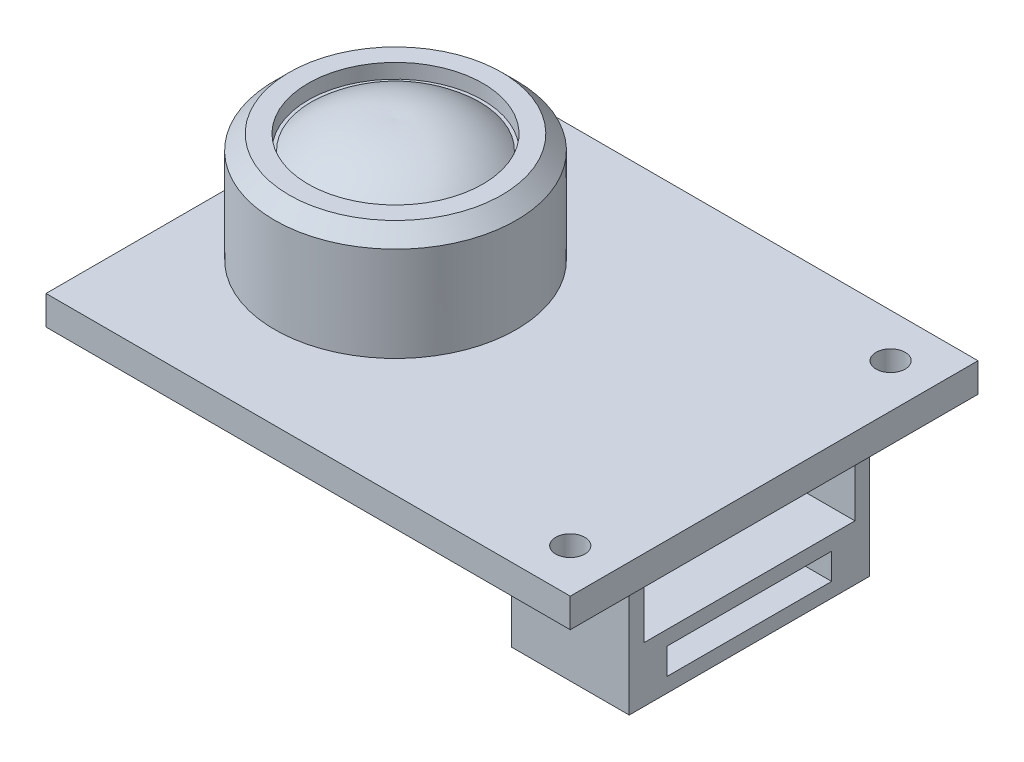
ISO-10303-21;
HEADER;
FILE_DESCRIPTION(('STEP AP214'),'2;1');
FILE_NAME('part.step','',(''),(''),'','','');
FILE_SCHEMA(('AUTOMOTIVE_DESIGN { 1 0 10303 214 1 1 1 1 }'));
ENDSEC;
DATA;
#1=APPLICATION_CONTEXT('core data for automotive mechanical design processes');
#2=APPLICATION_PROTOCOL_DEFINITION('international standard','automotive_design',2000,#1);
#3=PRODUCT_CONTEXT('',#1,'mechanical');
#4=PRODUCT('Part','Part','',(#3));
#5=PRODUCT_RELATED_PRODUCT_CATEGORY('part','',(#4));
#6=PRODUCT_DEFINITION_FORMATION('','',#4);
#7=PRODUCT_DEFINITION_CONTEXT('part definition',#1,'design');
#8=PRODUCT_DEFINITION('design','',#6,#7);
#9=PRODUCT_DEFINITION_SHAPE('','',#8);
#10=(LENGTH_UNIT() NAMED_UNIT(*) SI_UNIT(.MILLI.,.METRE.));
#11=(NAMED_UNIT(*) PLANE_ANGLE_UNIT() SI_UNIT($,.RADIAN.));
#12=(NAMED_UNIT(*) SI_UNIT($,.STERADIAN.) SOLID_ANGLE_UNIT());
#13=UNCERTAINTY_MEASURE_WITH_UNIT(LENGTH_MEASURE(1.E-05),#10,'distance_accuracy_value','');
#14=(GEOMETRIC_REPRESENTATION_CONTEXT(3) GLOBAL_UNCERTAINTY_ASSIGNED_CONTEXT((#13)) GLOBAL_UNIT_ASSIGNED_CONTEXT((#10,
#11,#12)) REPRESENTATION_CONTEXT('',''));
#15=CARTESIAN_POINT('',(0.,0.,0.));
#16=DIRECTION('',(0.,0.,1.));
#17=DIRECTION('',(1.,0.,0.));
#18=AXIS2_PLACEMENT_3D('',#15,#16,#17);
#19=CARTESIAN_POINT('',(0.,0.,0.));
#20=DIRECTION('',(0.,-1.,0.));
#21=DIRECTION('',(0.,0.,-1.));
#22=AXIS2_PLACEMENT_3D('',#19,#20,#21);
#23=PLANE('',#22);
#24=CARTESIAN_POINT('',(16.5,0.,-12.5));
#25=DIRECTION('',(0.,1.,0.));
#26=DIRECTION('',(0.,0.,1.));
#27=AXIS2_PLACEMENT_3D('',#24,#25,#26);
#28=CIRCLE('',#27,0.499999999999999);
#29=CARTESIAN_POINT('',(16.5,0.,-12.));
#30=VERTEX_POINT('',#29);
#31=EDGE_CURVE('E212',#30,#30,#28,.T.);
#32=ORIENTED_EDGE('',*,*,#31,.T.);
#33=EDGE_LOOP('',(#32));
#34=FACE_BOUND('',#33,.T.);
#35=DIRECTION('',(0.,0.,1.));
#36=VECTOR('',#35,1.);
#37=CARTESIAN_POINT('',(0.,0.,0.));
#38=LINE('',#37,#36);
#39=CARTESIAN_POINT('',(0.,0.,-14.));
#40=VERTEX_POINT('',#39);
#41=CARTESIAN_POINT('',(0.,0.,0.));
#42=VERTEX_POINT('',#41);
#43=EDGE_CURVE('E199',#40,#42,#38,.T.);
#44=ORIENTED_EDGE('',*,*,#43,.F.);
#45=DIRECTION('',(-1.,0.,0.));
#46=VECTOR('',#45,1.);
#47=CARTESIAN_POINT('',(0.,0.,-14.));
#48=LINE('',#47,#46);
#49=CARTESIAN_POINT('',(18.,0.,-14.));
#50=VERTEX_POINT('',#49);
#51=EDGE_CURVE('E219',#50,#40,#48,.T.);
#52=ORIENTED_EDGE('',*,*,#51,.F.);
#53=DIRECTION('',(0.,0.,-1.));
#54=VECTOR('',#53,1.);
#55=CARTESIAN_POINT('',(18.,0.,0.));
#56=LINE('',#55,#54);
#57=CARTESIAN_POINT('',(18.,0.,0.));
#58=VERTEX_POINT('',#57);
#59=EDGE_CURVE('E209',#58,#50,#56,.T.);
#60=ORIENTED_EDGE('',*,*,#59,.F.);
#61=DIRECTION('',(1.,0.,0.));
#62=VECTOR('',#61,1.);
#63=CARTESIAN_POINT('',(0.,0.,0.));
#64=LINE('',#63,#62);
#65=EDGE_CURVE('E206',#42,#58,#64,.T.);
#66=ORIENTED_EDGE('',*,*,#65,.F.);
#67=EDGE_LOOP('',(#44,#52,#60,#66));
#68=FACE_BOUND('',#67,.T.);
#69=CARTESIAN_POINT('',(16.5,0.,-1.5));
#70=DIRECTION('',(0.,1.,0.));
#71=DIRECTION('',(0.,0.,1.));
#72=AXIS2_PLACEMENT_3D('',#69,#70,#71);
#73=CIRCLE('',#72,0.499999999999999);
#74=CARTESIAN_POINT('',(16.5,0.,-1.));
#75=VERTEX_POINT('',#74);
#76=EDGE_CURVE('E346',#75,#75,#73,.T.);
#77=ORIENTED_EDGE('',*,*,#76,.T.);
#78=EDGE_LOOP('',(#77));
#79=FACE_BOUND('',#78,.T.);
#80=DIRECTION('',(-1.,0.,0.));
#81=VECTOR('',#80,1.);
#82=CARTESIAN_POINT('',(17.15,0.,-2.875));
#83=LINE('',#82,#81);
#84=CARTESIAN_POINT('',(17.15,0.,-2.875));
#85=VERTEX_POINT('',#84);
#86=CARTESIAN_POINT('',(13.1,0.,-2.875));
#87=VERTEX_POINT('',#86);
#88=EDGE_CURVE('E331',#85,#87,#83,.T.);
#89=ORIENTED_EDGE('',*,*,#88,.F.);
#90=DIRECTION('',(0.,0.,1.));
#91=VECTOR('',#90,1.);
#92=CARTESIAN_POINT('',(17.15,0.,-11.125));
#93=LINE('',#92,#91);
#94=CARTESIAN_POINT('',(17.15,0.,-11.125));
#95=VERTEX_POINT('',#94);
#96=EDGE_CURVE('E312',#95,#85,#93,.T.);
#97=ORIENTED_EDGE('',*,*,#96,.F.);
#98=DIRECTION('',(1.,0.,0.));
#99=VECTOR('',#98,1.);
#100=CARTESIAN_POINT('',(17.15,0.,-11.125));
#101=LINE('',#100,#99);
#102=CARTESIAN_POINT('',(13.1,0.,-11.125));
#103=VERTEX_POINT('',#102);
#104=EDGE_CURVE('E322',#103,#95,#101,.T.);
#105=ORIENTED_EDGE('',*,*,#104,.F.);
#106=DIRECTION('',(0.,0.,-1.));
#107=VECTOR('',#106,1.);
#108=CARTESIAN_POINT('',(13.1,0.,-11.125));
#109=LINE('',#108,#107);
#110=EDGE_CURVE('E333',#87,#103,#109,.T.);
#111=ORIENTED_EDGE('',*,*,#110,.F.);
#112=EDGE_LOOP('',(#89,#97,#105,#111));
#113=FACE_BOUND('',#112,.T.);
#114=ADVANCED_FACE('F40',(#34,#68,#79,#113),#23,.T.);
#115=CARTESIAN_POINT('',(0.,1.,0.));
#116=DIRECTION('',(0.,-1.,0.));
#117=DIRECTION('',(0.,0.,-1.));
#118=AXIS2_PLACEMENT_3D('',#115,#116,#117);
#119=PLANE('',#118);
#120=CARTESIAN_POINT('',(5.,1.,-7.));
#121=DIRECTION('',(0.,-1.,0.));
#122=DIRECTION('',(0.,0.,-1.));
#123=AXIS2_PLACEMENT_3D('',#120,#121,#122);
#124=CIRCLE('',#123,4.15);
#125=CARTESIAN_POINT('',(5.,1.,-11.15));
#126=VERTEX_POINT('',#125);
#127=EDGE_CURVE('E230',#126,#126,#124,.F.);
#128=ORIENTED_EDGE('',*,*,#127,.F.);
#129=EDGE_LOOP('',(#128));
#130=FACE_BOUND('',#129,.T.);
#131=DIRECTION('',(0.,0.,1.));
#132=VECTOR('',#131,1.);
#133=CARTESIAN_POINT('',(0.,1.,0.));
#134=LINE('',#133,#132);
#135=CARTESIAN_POINT('',(0.,1.,-14.));
#136=VERTEX_POINT('',#135);
#137=CARTESIAN_POINT('',(0.,1.,0.));
#138=VERTEX_POINT('',#137);
#139=EDGE_CURVE('E221',#136,#138,#134,.T.);
#140=ORIENTED_EDGE('',*,*,#139,.T.);
#141=DIRECTION('',(1.,0.,0.));
#142=VECTOR('',#141,1.);
#143=CARTESIAN_POINT('',(0.,1.,0.));
#144=LINE('',#143,#142);
#145=CARTESIAN_POINT('',(18.,1.,0.));
#146=VERTEX_POINT('',#145);
#147=EDGE_CURVE('E355',#138,#146,#144,.T.);
#148=ORIENTED_EDGE('',*,*,#147,.T.);
#149=DIRECTION('',(0.,0.,-1.));
#150=VECTOR('',#149,1.);
#151=CARTESIAN_POINT('',(18.,1.,0.));
#152=LINE('',#151,#150);
#153=CARTESIAN_POINT('',(18.,1.,-14.));
#154=VERTEX_POINT('',#153);
#155=EDGE_CURVE('E356',#146,#154,#152,.T.);
#156=ORIENTED_EDGE('',*,*,#155,.T.);
#157=DIRECTION('',(-1.,0.,0.));
#158=VECTOR('',#157,1.);
#159=CARTESIAN_POINT('',(0.,1.,-14.));
#160=LINE('',#159,#158);
#161=EDGE_CURVE('E215',#154,#136,#160,.T.);
#162=ORIENTED_EDGE('',*,*,#161,.T.);
#163=EDGE_LOOP('',(#140,#148,#156,#162));
#164=FACE_BOUND('',#163,.T.);
#165=CARTESIAN_POINT('',(16.5,1.,-12.5));
#166=DIRECTION('',(0.,1.,0.));
#167=DIRECTION('',(0.,0.,1.));
#168=AXIS2_PLACEMENT_3D('',#165,#166,#167);
#169=CIRCLE('',#168,0.499999999999999);
#170=CARTESIAN_POINT('',(16.5,1.,-12.));
#171=VERTEX_POINT('',#170);
#172=EDGE_CURVE('E207',#171,#171,#169,.T.);
#173=ORIENTED_EDGE('',*,*,#172,.F.);
#174=EDGE_LOOP('',(#173));
#175=FACE_BOUND('',#174,.T.);
#176=CARTESIAN_POINT('',(16.5,1.,-1.5));
#177=DIRECTION('',(0.,1.,0.));
#178=DIRECTION('',(0.,0.,1.));
#179=AXIS2_PLACEMENT_3D('',#176,#177,#178);
#180=CIRCLE('',#179,0.499999999999999);
#181=CARTESIAN_POINT('',(16.5,1.,-1.));
#182=VERTEX_POINT('',#181);
#183=EDGE_CURVE('E347',#182,#182,#180,.T.);
#184=ORIENTED_EDGE('',*,*,#183,.F.);
#185=EDGE_LOOP('',(#184));
#186=FACE_BOUND('',#185,.T.);
#187=ADVANCED_FACE('F166',(#130,#164,#175,#186),#119,.F.);
#188=CARTESIAN_POINT('',(0.,1.,0.));
#189=DIRECTION('',(1.,0.,0.));
#190=DIRECTION('',(0.,0.,-1.));
#191=AXIS2_PLACEMENT_3D('',#188,#189,#190);
#192=PLANE('',#191);
#193=ORIENTED_EDGE('',*,*,#43,.T.);
#194=DIRECTION('',(0.,-1.,0.));
#195=VECTOR('',#194,1.);
#196=CARTESIAN_POINT('',(0.,1.,0.));
#197=LINE('',#196,#195);
#198=EDGE_CURVE('E202',#138,#42,#197,.T.);
#199=ORIENTED_EDGE('',*,*,#198,.F.);
#200=ORIENTED_EDGE('',*,*,#139,.F.);
#201=DIRECTION('',(0.,-1.,0.));
#202=VECTOR('',#201,1.);
#203=CARTESIAN_POINT('',(0.,1.,-14.));
#204=LINE('',#203,#202);
#205=EDGE_CURVE('E204',#136,#40,#204,.T.);
#206=ORIENTED_EDGE('',*,*,#205,.T.);
#207=EDGE_LOOP('',(#193,#199,#200,#206));
#208=FACE_BOUND('',#207,.T.);
#209=ADVANCED_FACE('F172',(#208),#192,.F.);
#210=CARTESIAN_POINT('',(0.,1.,0.));
#211=DIRECTION('',(0.,0.,-1.));
#212=DIRECTION('',(-1.,0.,0.));
#213=AXIS2_PLACEMENT_3D('',#210,#211,#212);
#214=PLANE('',#213);
#215=ORIENTED_EDGE('',*,*,#65,.T.);
#216=DIRECTION('',(0.,-1.,0.));
#217=VECTOR('',#216,1.);
#218=CARTESIAN_POINT('',(18.,1.,0.));
#219=LINE('',#218,#217);
#220=EDGE_CURVE('E226',#146,#58,#219,.T.);
#221=ORIENTED_EDGE('',*,*,#220,.F.);
#222=ORIENTED_EDGE('',*,*,#147,.F.);
#223=ORIENTED_EDGE('',*,*,#198,.T.);
#224=EDGE_LOOP('',(#215,#221,#222,#223));
#225=FACE_BOUND('',#224,.T.);
#226=ADVANCED_FACE('F187',(#225),#214,.F.);
#227=CARTESIAN_POINT('',(18.,1.,0.));
#228=DIRECTION('',(-1.,0.,0.));
#229=DIRECTION('',(0.,0.,1.));
#230=AXIS2_PLACEMENT_3D('',#227,#228,#229);
#231=PLANE('',#230);
#232=ORIENTED_EDGE('',*,*,#59,.T.);
#233=DIRECTION('',(0.,-1.,0.));
#234=VECTOR('',#233,1.);
#235=CARTESIAN_POINT('',(18.,1.,-14.));
#236=LINE('',#235,#234);
#237=EDGE_CURVE('E223',#154,#50,#236,.T.);
#238=ORIENTED_EDGE('',*,*,#237,.F.);
#239=ORIENTED_EDGE('',*,*,#155,.F.);
#240=ORIENTED_EDGE('',*,*,#220,.T.);
#241=EDGE_LOOP('',(#232,#238,#239,#240));
#242=FACE_BOUND('',#241,.T.);
#243=ADVANCED_FACE('F183',(#242),#231,.F.);
#244=CARTESIAN_POINT('',(0.,1.,-14.));
#245=DIRECTION('',(0.,0.,1.));
#246=DIRECTION('',(1.,0.,0.));
#247=AXIS2_PLACEMENT_3D('',#244,#245,#246);
#248=PLANE('',#247);
#249=ORIENTED_EDGE('',*,*,#51,.T.);
#250=ORIENTED_EDGE('',*,*,#205,.F.);
#251=ORIENTED_EDGE('',*,*,#161,.F.);
#252=ORIENTED_EDGE('',*,*,#237,.T.);
#253=EDGE_LOOP('',(#249,#250,#251,#252));
#254=FACE_BOUND('',#253,.T.);
#255=ADVANCED_FACE('F179',(#254),#248,.F.);
#256=CARTESIAN_POINT('',(16.5,1.,-12.5));
#257=DIRECTION('',(0.,-1.,0.));
#258=DIRECTION('',(0.,0.,-1.));
#259=AXIS2_PLACEMENT_3D('',#256,#257,#258);
#260=CYLINDRICAL_SURFACE('',#259,0.499999999999999);
#261=ORIENTED_EDGE('',*,*,#172,.T.);
#262=EDGE_LOOP('',(#261));
#263=FACE_BOUND('',#262,.T.);
#264=ORIENTED_EDGE('',*,*,#31,.F.);
#265=EDGE_LOOP('',(#264));
#266=FACE_BOUND('',#265,.T.);
#267=ADVANCED_FACE('F182',(#263,#266),#260,.F.);
#268=CARTESIAN_POINT('',(16.5,1.,-1.5));
#269=DIRECTION('',(0.,-1.,0.));
#270=DIRECTION('',(0.,0.,-1.));
#271=AXIS2_PLACEMENT_3D('',#268,#269,#270);
#272=CYLINDRICAL_SURFACE('',#271,0.499999999999999);
#273=ORIENTED_EDGE('',*,*,#183,.T.);
#274=EDGE_LOOP('',(#273));
#275=FACE_BOUND('',#274,.T.);
#276=ORIENTED_EDGE('',*,*,#76,.F.);
#277=EDGE_LOOP('',(#276));
#278=FACE_BOUND('',#277,.T.);
#279=ADVANCED_FACE('F405',(#275,#278),#272,.F.);
#280=CARTESIAN_POINT('',(5.,4.75,-7.));
#281=DIRECTION('',(0.,-1.,0.));
#282=DIRECTION('',(0.,0.,-1.));
#283=AXIS2_PLACEMENT_3D('',#280,#281,#282);
#284=CYLINDRICAL_SURFACE('',#283,4.15);
#285=CARTESIAN_POINT('',(5.,4.25,-7.));
#286=DIRECTION('',(0.,1.,0.));
#287=DIRECTION('',(0.,0.,1.));
#288=AXIS2_PLACEMENT_3D('',#285,#286,#287);
#289=CIRCLE('',#288,4.15);
#290=CARTESIAN_POINT('',(5.,4.25,-2.85));
#291=VERTEX_POINT('',#290);
#292=EDGE_CURVE('E48',#291,#291,#289,.F.);
#293=ORIENTED_EDGE('',*,*,#292,.T.);
#294=EDGE_LOOP('',(#293));
#295=FACE_BOUND('',#294,.T.);
#296=ORIENTED_EDGE('',*,*,#127,.T.);
#297=EDGE_LOOP('',(#296));
#298=FACE_BOUND('',#297,.T.);
#299=ADVANCED_FACE('F238',(#295,#298),#284,.T.);
#300=CARTESIAN_POINT('',(5.,4.75,-7.));
#301=DIRECTION('',(0.,1.,0.));
#302=DIRECTION('',(0.,0.,1.));
#303=AXIS2_PLACEMENT_3D('',#300,#301,#302);
#304=PLANE('',#303);
#305=CARTESIAN_POINT('',(5.,4.75,-7.));
#306=DIRECTION('',(0.,1.,0.));
#307=DIRECTION('',(0.,0.,1.));
#308=AXIS2_PLACEMENT_3D('',#305,#306,#307);
#309=CIRCLE('',#308,3.65);
#310=CARTESIAN_POINT('',(5.,4.75,-3.35));
#311=VERTEX_POINT('',#310);
#312=EDGE_CURVE('E233',#311,#311,#309,.T.);
#313=ORIENTED_EDGE('',*,*,#312,.T.);
#314=EDGE_LOOP('',(#313));
#315=FACE_BOUND('',#314,.T.);
#316=CARTESIAN_POINT('',(5.,4.75,-7.));
#317=DIRECTION('',(0.,1.,0.));
#318=DIRECTION('',(0.,0.,1.));
#319=AXIS2_PLACEMENT_3D('',#316,#317,#318);
#320=CIRCLE('',#319,3.);
#321=CARTESIAN_POINT('',(5.,4.75,-4.));
#322=VERTEX_POINT('',#321);
#323=EDGE_CURVE('E250',#322,#322,#320,.T.);
#324=ORIENTED_EDGE('',*,*,#323,.F.);
#325=EDGE_LOOP('',(#324));
#326=FACE_BOUND('',#325,.T.);
#327=ADVANCED_FACE('F243',(#315,#326),#304,.T.);
#328=CARTESIAN_POINT('',(17.15,-4.4,-11.125));
#329=DIRECTION('',(-1.,0.,0.));
#330=DIRECTION('',(0.,0.,1.));
#331=AXIS2_PLACEMENT_3D('',#328,#329,#330);
#332=PLANE('',#331);
#333=DIRECTION('',(0.,0.,-1.));
#334=VECTOR('',#333,1.);
#335=CARTESIAN_POINT('',(17.15,-3.9,-4.175));
#336=LINE('',#335,#334);
#337=CARTESIAN_POINT('',(17.15,-3.9,-4.175));
#338=VERTEX_POINT('',#337);
#339=CARTESIAN_POINT('',(17.15,-3.9,-9.825));
#340=VERTEX_POINT('',#339);
#341=EDGE_CURVE('E272',#338,#340,#336,.T.);
#342=ORIENTED_EDGE('',*,*,#341,.F.);
#343=DIRECTION('',(0.,-1.,0.));
#344=VECTOR('',#343,1.);
#345=CARTESIAN_POINT('',(17.15,-3.,-4.175));
#346=LINE('',#345,#344);
#347=CARTESIAN_POINT('',(17.15,-3.,-4.175));
#348=VERTEX_POINT('',#347);
#349=EDGE_CURVE('E55',#348,#338,#346,.T.);
#350=ORIENTED_EDGE('',*,*,#349,.F.);
#351=DIRECTION('',(0.,0.,1.));
#352=VECTOR('',#351,1.);
#353=CARTESIAN_POINT('',(17.15,-3.,-4.175));
#354=LINE('',#353,#352);
#355=CARTESIAN_POINT('',(17.15,-3.,-9.825));
#356=VERTEX_POINT('',#355);
#357=EDGE_CURVE('E261',#356,#348,#354,.T.);
#358=ORIENTED_EDGE('',*,*,#357,.F.);
#359=DIRECTION('',(0.,1.,0.));
#360=VECTOR('',#359,1.);
#361=CARTESIAN_POINT('',(17.15,-3.,-9.825));
#362=LINE('',#361,#360);
#363=EDGE_CURVE('E275',#340,#356,#362,.T.);
#364=ORIENTED_EDGE('',*,*,#363,.F.);
#365=EDGE_LOOP('',(#342,#350,#358,#364));
#366=FACE_BOUND('',#365,.T.);
#367=DIRECTION('',(0.,0.,-1.));
#368=VECTOR('',#367,1.);
#369=CARTESIAN_POINT('',(17.15,-2.5,-3.375));
#370=LINE('',#369,#368);
#371=CARTESIAN_POINT('',(17.15,-2.5,-3.375));
#372=VERTEX_POINT('',#371);
#373=CARTESIAN_POINT('',(17.15,-2.5,-10.625));
#374=VERTEX_POINT('',#373);
#375=EDGE_CURVE('E302',#372,#374,#370,.T.);
#376=ORIENTED_EDGE('',*,*,#375,.F.);
#377=DIRECTION('',(0.,-1.,0.));
#378=VECTOR('',#377,1.);
#379=CARTESIAN_POINT('',(17.15,-0.5,-3.375));
#380=LINE('',#379,#378);
#381=CARTESIAN_POINT('',(17.15,-0.5,-3.375));
#382=VERTEX_POINT('',#381);
#383=EDGE_CURVE('E63',#382,#372,#380,.T.);
#384=ORIENTED_EDGE('',*,*,#383,.F.);
#385=DIRECTION('',(0.,0.,1.));
#386=VECTOR('',#385,1.);
#387=CARTESIAN_POINT('',(17.15,-0.5,-3.375));
#388=LINE('',#387,#386);
#389=CARTESIAN_POINT('',(17.15,-0.5,-10.625));
#390=VERTEX_POINT('',#389);
#391=EDGE_CURVE('E291',#390,#382,#388,.T.);
#392=ORIENTED_EDGE('',*,*,#391,.F.);
#393=DIRECTION('',(0.,1.,0.));
#394=VECTOR('',#393,1.);
#395=CARTESIAN_POINT('',(17.15,-0.5,-10.625));
#396=LINE('',#395,#394);
#397=EDGE_CURVE('E305',#374,#390,#396,.T.);
#398=ORIENTED_EDGE('',*,*,#397,.F.);
#399=EDGE_LOOP('',(#376,#384,#392,#398));
#400=FACE_BOUND('',#399,.T.);
#401=ORIENTED_EDGE('',*,*,#96,.T.);
#402=DIRECTION('',(0.,1.,0.));
#403=VECTOR('',#402,1.);
#404=CARTESIAN_POINT('',(17.15,-4.4,-2.875));
#405=LINE('',#404,#403);
#406=CARTESIAN_POINT('',(17.15,-4.4,-2.875));
#407=VERTEX_POINT('',#406);
#408=EDGE_CURVE('E344',#407,#85,#405,.T.);
#409=ORIENTED_EDGE('',*,*,#408,.F.);
#410=DIRECTION('',(0.,0.,1.));
#411=VECTOR('',#410,1.);
#412=CARTESIAN_POINT('',(17.15,-4.4,-11.125));
#413=LINE('',#412,#411);
#414=CARTESIAN_POINT('',(17.15,-4.4,-11.125));
#415=VERTEX_POINT('',#414);
#416=EDGE_CURVE('E318',#415,#407,#413,.T.);
#417=ORIENTED_EDGE('',*,*,#416,.F.);
#418=DIRECTION('',(0.,1.,0.));
#419=VECTOR('',#418,1.);
#420=CARTESIAN_POINT('',(17.15,-4.4,-11.125));
#421=LINE('',#420,#419);
#422=EDGE_CURVE('E328',#415,#95,#421,.T.);
#423=ORIENTED_EDGE('',*,*,#422,.T.);
#424=EDGE_LOOP('',(#401,#409,#417,#423));
#425=FACE_BOUND('',#424,.T.);
#426=ADVANCED_FACE('F246',(#366,#400,#425),#332,.F.);
#427=CARTESIAN_POINT('',(17.15,-4.4,-2.875));
#428=DIRECTION('',(0.,0.,-1.));
#429=DIRECTION('',(-1.,0.,0.));
#430=AXIS2_PLACEMENT_3D('',#427,#428,#429);
#431=PLANE('',#430);
#432=ORIENTED_EDGE('',*,*,#88,.T.);
#433=DIRECTION('',(0.,1.,0.));
#434=VECTOR('',#433,1.);
#435=CARTESIAN_POINT('',(13.1,-4.4,-2.875));
#436=LINE('',#435,#434);
#437=CARTESIAN_POINT('',(13.1,-4.4,-2.875));
#438=VERTEX_POINT('',#437);
#439=EDGE_CURVE('E341',#438,#87,#436,.T.);
#440=ORIENTED_EDGE('',*,*,#439,.F.);
#441=DIRECTION('',(-1.,0.,0.));
#442=VECTOR('',#441,1.);
#443=CARTESIAN_POINT('',(17.15,-4.4,-2.875));
#444=LINE('',#443,#442);
#445=EDGE_CURVE('E321',#407,#438,#444,.T.);
#446=ORIENTED_EDGE('',*,*,#445,.F.);
#447=ORIENTED_EDGE('',*,*,#408,.T.);
#448=EDGE_LOOP('',(#432,#440,#446,#447));
#449=FACE_BOUND('',#448,.T.);
#450=ADVANCED_FACE('F373',(#449),#431,.F.);
#451=CARTESIAN_POINT('',(13.1,-4.4,-11.125));
#452=DIRECTION('',(1.,0.,0.));
#453=DIRECTION('',(0.,0.,-1.));
#454=AXIS2_PLACEMENT_3D('',#451,#452,#453);
#455=PLANE('',#454);
#456=ORIENTED_EDGE('',*,*,#110,.T.);
#457=DIRECTION('',(0.,1.,0.));
#458=VECTOR('',#457,1.);
#459=CARTESIAN_POINT('',(13.1,-4.4,-11.125));
#460=LINE('',#459,#458);
#461=CARTESIAN_POINT('',(13.1,-4.4,-11.125));
#462=VERTEX_POINT('',#461);
#463=EDGE_CURVE('E339',#462,#103,#460,.T.);
#464=ORIENTED_EDGE('',*,*,#463,.F.);
#465=DIRECTION('',(0.,0.,-1.));
#466=VECTOR('',#465,1.);
#467=CARTESIAN_POINT('',(13.1,-4.4,-11.125));
#468=LINE('',#467,#466);
#469=EDGE_CURVE('E324',#438,#462,#468,.T.);
#470=ORIENTED_EDGE('',*,*,#469,.F.);
#471=ORIENTED_EDGE('',*,*,#439,.T.);
#472=EDGE_LOOP('',(#456,#464,#470,#471));
#473=FACE_BOUND('',#472,.T.);
#474=ADVANCED_FACE('F377',(#473),#455,.F.);
#475=CARTESIAN_POINT('',(17.15,-4.4,-11.125));
#476=DIRECTION('',(0.,0.,1.));
#477=DIRECTION('',(1.,0.,0.));
#478=AXIS2_PLACEMENT_3D('',#475,#476,#477);
#479=PLANE('',#478);
#480=ORIENTED_EDGE('',*,*,#104,.T.);
#481=ORIENTED_EDGE('',*,*,#422,.F.);
#482=DIRECTION('',(1.,0.,0.));
#483=VECTOR('',#482,1.);
#484=CARTESIAN_POINT('',(17.15,-4.4,-11.125));
#485=LINE('',#484,#483);
#486=EDGE_CURVE('E326',#462,#415,#485,.T.);
#487=ORIENTED_EDGE('',*,*,#486,.F.);
#488=ORIENTED_EDGE('',*,*,#463,.T.);
#489=EDGE_LOOP('',(#480,#481,#487,#488));
#490=FACE_BOUND('',#489,.T.);
#491=ADVANCED_FACE('F386',(#490),#479,.F.);
#492=CARTESIAN_POINT('',(0.,-4.4,0.));
#493=DIRECTION('',(0.,-1.,0.));
#494=DIRECTION('',(0.,0.,-1.));
#495=AXIS2_PLACEMENT_3D('',#492,#493,#494);
#496=PLANE('',#495);
#497=ORIENTED_EDGE('',*,*,#416,.T.);
#498=ORIENTED_EDGE('',*,*,#445,.T.);
#499=ORIENTED_EDGE('',*,*,#469,.T.);
#500=ORIENTED_EDGE('',*,*,#486,.T.);
#501=EDGE_LOOP('',(#497,#498,#499,#500));
#502=FACE_BOUND('',#501,.T.);
#503=ADVANCED_FACE('F381',(#502),#496,.T.);
#504=CARTESIAN_POINT('',(14.15,-0.5,-3.375));
#505=DIRECTION('',(0.,0.,1.));
#506=DIRECTION('',(0.,-1.,0.));
#507=AXIS2_PLACEMENT_3D('',#504,#505,#506);
#508=PLANE('',#507);
#509=ORIENTED_EDGE('',*,*,#383,.T.);
#510=DIRECTION('',(1.,0.,0.));
#511=VECTOR('',#510,1.);
#512=CARTESIAN_POINT('',(14.15,-2.5,-3.375));
#513=LINE('',#512,#511);
#514=CARTESIAN_POINT('',(14.15,-2.5,-3.375));
#515=VERTEX_POINT('',#514);
#516=EDGE_CURVE('E300',#515,#372,#513,.T.);
#517=ORIENTED_EDGE('',*,*,#516,.F.);
#518=DIRECTION('',(0.,-1.,0.));
#519=VECTOR('',#518,1.);
#520=CARTESIAN_POINT('',(14.15,-0.5,-3.375));
#521=LINE('',#520,#519);
#522=CARTESIAN_POINT('',(14.15,-0.5,-3.375));
#523=VERTEX_POINT('',#522);
#524=EDGE_CURVE('E287',#523,#515,#521,.T.);
#525=ORIENTED_EDGE('',*,*,#524,.F.);
#526=DIRECTION('',(1.,0.,0.));
#527=VECTOR('',#526,1.);
#528=CARTESIAN_POINT('',(14.15,-0.5,-3.375));
#529=LINE('',#528,#527);
#530=EDGE_CURVE('E310',#523,#382,#529,.T.);
#531=ORIENTED_EDGE('',*,*,#530,.T.);
#532=EDGE_LOOP('',(#509,#517,#525,#531));
#533=FACE_BOUND('',#532,.T.);
#534=ADVANCED_FACE('F393',(#533),#508,.F.);
#535=CARTESIAN_POINT('',(14.15,-0.5,-3.375));
#536=DIRECTION('',(0.,1.,0.));
#537=DIRECTION('',(0.,0.,1.));
#538=AXIS2_PLACEMENT_3D('',#535,#536,#537);
#539=PLANE('',#538);
#540=ORIENTED_EDGE('',*,*,#391,.T.);
#541=ORIENTED_EDGE('',*,*,#530,.F.);
#542=DIRECTION('',(0.,0.,1.));
#543=VECTOR('',#542,1.);
#544=CARTESIAN_POINT('',(14.15,-0.5,-3.375));
#545=LINE('',#544,#543);
#546=CARTESIAN_POINT('',(14.15,-0.5,-10.625));
#547=VERTEX_POINT('',#546);
#548=EDGE_CURVE('E297',#547,#523,#545,.T.);
#549=ORIENTED_EDGE('',*,*,#548,.F.);
#550=DIRECTION('',(1.,0.,0.));
#551=VECTOR('',#550,1.);
#552=CARTESIAN_POINT('',(14.15,-0.5,-10.625));
#553=LINE('',#552,#551);
#554=EDGE_CURVE('E313',#547,#390,#553,.T.);
#555=ORIENTED_EDGE('',*,*,#554,.T.);
#556=EDGE_LOOP('',(#540,#541,#549,#555));
#557=FACE_BOUND('',#556,.T.);
#558=ADVANCED_FACE('F466',(#557),#539,.F.);
#559=CARTESIAN_POINT('',(14.15,-0.5,-10.625));
#560=DIRECTION('',(0.,0.,-1.));
#561=DIRECTION('',(-1.,0.,0.));
#562=AXIS2_PLACEMENT_3D('',#559,#560,#561);
#563=PLANE('',#562);
#564=ORIENTED_EDGE('',*,*,#397,.T.);
#565=ORIENTED_EDGE('',*,*,#554,.F.);
#566=DIRECTION('',(0.,1.,0.));
#567=VECTOR('',#566,1.);
#568=CARTESIAN_POINT('',(14.15,-0.5,-10.625));
#569=LINE('',#568,#567);
#570=CARTESIAN_POINT('',(14.15,-2.5,-10.625));
#571=VERTEX_POINT('',#570);
#572=EDGE_CURVE('E294',#571,#547,#569,.T.);
#573=ORIENTED_EDGE('',*,*,#572,.F.);
#574=DIRECTION('',(1.,0.,0.));
#575=VECTOR('',#574,1.);
#576=CARTESIAN_POINT('',(14.15,-2.5,-10.625));
#577=LINE('',#576,#575);
#578=EDGE_CURVE('E315',#571,#374,#577,.T.);
#579=ORIENTED_EDGE('',*,*,#578,.T.);
#580=EDGE_LOOP('',(#564,#565,#573,#579));
#581=FACE_BOUND('',#580,.T.);
#582=ADVANCED_FACE('F471',(#581),#563,.F.);
#583=CARTESIAN_POINT('',(14.15,-2.5,-3.375));
#584=DIRECTION('',(0.,-1.,0.));
#585=DIRECTION('',(0.,0.,-1.));
#586=AXIS2_PLACEMENT_3D('',#583,#584,#585);
#587=PLANE('',#586);
#588=ORIENTED_EDGE('',*,*,#375,.T.);
#589=ORIENTED_EDGE('',*,*,#578,.F.);
#590=DIRECTION('',(0.,0.,-1.));
#591=VECTOR('',#590,1.);
#592=CARTESIAN_POINT('',(14.15,-2.5,-3.375));
#593=LINE('',#592,#591);
#594=EDGE_CURVE('E290',#515,#571,#593,.T.);
#595=ORIENTED_EDGE('',*,*,#594,.F.);
#596=ORIENTED_EDGE('',*,*,#516,.T.);
#597=EDGE_LOOP('',(#588,#589,#595,#596));
#598=FACE_BOUND('',#597,.T.);
#599=ADVANCED_FACE('F479',(#598),#587,.F.);
#600=CARTESIAN_POINT('',(14.15,0.,0.));
#601=DIRECTION('',(1.,0.,0.));
#602=DIRECTION('',(0.,0.,-1.));
#603=AXIS2_PLACEMENT_3D('',#600,#601,#602);
#604=PLANE('',#603);
#605=ORIENTED_EDGE('',*,*,#524,.T.);
#606=ORIENTED_EDGE('',*,*,#594,.T.);
#607=ORIENTED_EDGE('',*,*,#572,.T.);
#608=ORIENTED_EDGE('',*,*,#548,.T.);
#609=EDGE_LOOP('',(#605,#606,#607,#608));
#610=FACE_BOUND('',#609,.T.);
#611=ADVANCED_FACE('F487',(#610),#604,.T.);
#612=CARTESIAN_POINT('',(14.15,-3.,-4.175));
#613=DIRECTION('',(0.,0.,1.));
#614=DIRECTION('',(1.,0.,0.));
#615=AXIS2_PLACEMENT_3D('',#612,#613,#614);
#616=PLANE('',#615);
#617=ORIENTED_EDGE('',*,*,#349,.T.);
#618=DIRECTION('',(1.,0.,0.));
#619=VECTOR('',#618,1.);
#620=CARTESIAN_POINT('',(14.15,-3.9,-4.175));
#621=LINE('',#620,#619);
#622=CARTESIAN_POINT('',(14.15,-3.9,-4.175));
#623=VERTEX_POINT('',#622);
#624=EDGE_CURVE('E270',#623,#338,#621,.T.);
#625=ORIENTED_EDGE('',*,*,#624,.F.);
#626=DIRECTION('',(0.,-1.,0.));
#627=VECTOR('',#626,1.);
#628=CARTESIAN_POINT('',(14.15,-3.,-4.175));
#629=LINE('',#628,#627);
#630=CARTESIAN_POINT('',(14.15,-3.,-4.175));
#631=VERTEX_POINT('',#630);
#632=EDGE_CURVE('E257',#631,#623,#629,.T.);
#633=ORIENTED_EDGE('',*,*,#632,.F.);
#634=DIRECTION('',(1.,0.,0.));
#635=VECTOR('',#634,1.);
#636=CARTESIAN_POINT('',(14.15,-3.,-4.175));
#637=LINE('',#636,#635);
#638=EDGE_CURVE('E280',#631,#348,#637,.T.);
#639=ORIENTED_EDGE('',*,*,#638,.T.);
#640=EDGE_LOOP('',(#617,#625,#633,#639));
#641=FACE_BOUND('',#640,.T.);
#642=ADVANCED_FACE('F495',(#641),#616,.F.);
#643=CARTESIAN_POINT('',(14.15,-3.,-4.175));
#644=DIRECTION('',(0.,1.,0.));
#645=DIRECTION('',(0.,0.,1.));
#646=AXIS2_PLACEMENT_3D('',#643,#644,#645);
#647=PLANE('',#646);
#648=ORIENTED_EDGE('',*,*,#357,.T.);
#649=ORIENTED_EDGE('',*,*,#638,.F.);
#650=DIRECTION('',(0.,0.,1.));
#651=VECTOR('',#650,1.);
#652=CARTESIAN_POINT('',(14.15,-3.,-4.175));
#653=LINE('',#652,#651);
#654=CARTESIAN_POINT('',(14.15,-3.,-9.825));
#655=VERTEX_POINT('',#654);
#656=EDGE_CURVE('E267',#655,#631,#653,.T.);
#657=ORIENTED_EDGE('',*,*,#656,.F.);
#658=DIRECTION('',(1.,0.,0.));
#659=VECTOR('',#658,1.);
#660=CARTESIAN_POINT('',(14.15,-3.,-9.825));
#661=LINE('',#660,#659);
#662=EDGE_CURVE('E282',#655,#356,#661,.T.);
#663=ORIENTED_EDGE('',*,*,#662,.T.);
#664=EDGE_LOOP('',(#648,#649,#657,#663));
#665=FACE_BOUND('',#664,.T.);
#666=ADVANCED_FACE('F503',(#665),#647,.F.);
#667=CARTESIAN_POINT('',(14.15,-3.,-9.825));
#668=DIRECTION('',(0.,0.,-1.));
#669=DIRECTION('',(-1.,0.,0.));
#670=AXIS2_PLACEMENT_3D('',#667,#668,#669);
#671=PLANE('',#670);
#672=ORIENTED_EDGE('',*,*,#363,.T.);
#673=ORIENTED_EDGE('',*,*,#662,.F.);
#674=DIRECTION('',(0.,1.,0.));
#675=VECTOR('',#674,1.);
#676=CARTESIAN_POINT('',(14.15,-3.,-9.825));
#677=LINE('',#676,#675);
#678=CARTESIAN_POINT('',(14.15,-3.9,-9.825));
#679=VERTEX_POINT('',#678);
#680=EDGE_CURVE('E264',#679,#655,#677,.T.);
#681=ORIENTED_EDGE('',*,*,#680,.F.);
#682=DIRECTION('',(1.,0.,0.));
#683=VECTOR('',#682,1.);
#684=CARTESIAN_POINT('',(14.15,-3.9,-9.825));
#685=LINE('',#684,#683);
#686=EDGE_CURVE('E284',#679,#340,#685,.T.);
#687=ORIENTED_EDGE('',*,*,#686,.T.);
#688=EDGE_LOOP('',(#672,#673,#681,#687));
#689=FACE_BOUND('',#688,.T.);
#690=ADVANCED_FACE('F510',(#689),#671,.F.);
#691=CARTESIAN_POINT('',(14.15,-3.9,-4.175));
#692=DIRECTION('',(0.,-1.,0.));
#693=DIRECTION('',(0.,0.,-1.));
#694=AXIS2_PLACEMENT_3D('',#691,#692,#693);
#695=PLANE('',#694);
#696=ORIENTED_EDGE('',*,*,#341,.T.);
#697=ORIENTED_EDGE('',*,*,#686,.F.);
#698=DIRECTION('',(0.,0.,-1.));
#699=VECTOR('',#698,1.);
#700=CARTESIAN_POINT('',(14.15,-3.9,-4.175));
#701=LINE('',#700,#699);
#702=EDGE_CURVE('E260',#623,#679,#701,.T.);
#703=ORIENTED_EDGE('',*,*,#702,.F.);
#704=ORIENTED_EDGE('',*,*,#624,.T.);
#705=EDGE_LOOP('',(#696,#697,#703,#704));
#706=FACE_BOUND('',#705,.T.);
#707=ADVANCED_FACE('F518',(#706),#695,.F.);
#708=CARTESIAN_POINT('',(14.15,0.,0.));
#709=DIRECTION('',(1.,0.,0.));
#710=DIRECTION('',(0.,0.,-1.));
#711=AXIS2_PLACEMENT_3D('',#708,#709,#710);
#712=PLANE('',#711);
#713=ORIENTED_EDGE('',*,*,#632,.T.);
#714=ORIENTED_EDGE('',*,*,#702,.T.);
#715=ORIENTED_EDGE('',*,*,#680,.T.);
#716=ORIENTED_EDGE('',*,*,#656,.T.);
#717=EDGE_LOOP('',(#713,#714,#715,#716));
#718=FACE_BOUND('',#717,.T.);
#719=ADVANCED_FACE('F526',(#718),#712,.T.);
#720=CARTESIAN_POINT('',(5.,4.25,-7.));
#721=DIRECTION('',(0.,1.,0.));
#722=DIRECTION('',(0.,0.,1.));
#723=AXIS2_PLACEMENT_3D('',#720,#721,#722);
#724=CYLINDRICAL_SURFACE('',#723,3.);
#725=CARTESIAN_POINT('',(5.,4.25,-7.));
#726=DIRECTION('',(0.,1.,0.));
#727=DIRECTION('',(0.,0.,1.));
#728=AXIS2_PLACEMENT_3D('',#725,#726,#727);
#729=CIRCLE('',#728,3.);
#730=CARTESIAN_POINT('',(5.,4.25,-4.));
#731=VERTEX_POINT('',#730);
#732=EDGE_CURVE('E252',#731,#731,#729,.T.);
#733=ORIENTED_EDGE('',*,*,#732,.F.);
#734=EDGE_LOOP('',(#733));
#735=FACE_BOUND('',#734,.T.);
#736=ORIENTED_EDGE('',*,*,#323,.T.);
#737=EDGE_LOOP('',(#736));
#738=FACE_BOUND('',#737,.T.);
#739=ADVANCED_FACE('F534',(#735,#738),#724,.F.);
#740=CARTESIAN_POINT('',(5.,4.25,-7.));
#741=DIRECTION('',(0.,1.,0.));
#742=DIRECTION('',(0.,0.,1.));
#743=AXIS2_PLACEMENT_3D('',#740,#741,#742);
#744=PLANE('',#743);
#745=CARTESIAN_POINT('',(4.99847421906452,4.25,-7.));
#746=DIRECTION('',(0.,-1.,0.));
#747=DIRECTION('',(0.,0.,-1.));
#748=AXIS2_PLACEMENT_3D('',#745,#746,#747);
#749=CIRCLE('',#748,2.88820272596063);
#750=CARTESIAN_POINT('',(4.99847421906452,4.25,-9.88820272596063));
#751=VERTEX_POINT('',#750);
#752=EDGE_CURVE('E11',#751,#751,#749,.F.);
#753=ORIENTED_EDGE('',*,*,#752,.F.);
#754=EDGE_LOOP('',(#753));
#755=FACE_BOUND('',#754,.T.);
#756=ORIENTED_EDGE('',*,*,#732,.T.);
#757=EDGE_LOOP('',(#756));
#758=FACE_BOUND('',#757,.T.);
#759=ADVANCED_FACE('F161',(#755,#758),#744,.T.);
#760=CARTESIAN_POINT('',(5.,4.75,-7.));
#761=DIRECTION('',(0.,-1.,0.));
#762=DIRECTION('',(0.,0.,-1.));
#763=AXIS2_PLACEMENT_3D('',#760,#761,#762);
#764=CONICAL_SURFACE('',#763,3.65,0.785398163397449);
#765=ORIENTED_EDGE('',*,*,#292,.F.);
#766=EDGE_LOOP('',(#765));
#767=FACE_BOUND('',#766,.T.);
#768=ORIENTED_EDGE('',*,*,#312,.F.);
#769=EDGE_LOOP('',(#768));
#770=FACE_BOUND('',#769,.T.);
#771=ADVANCED_FACE('F42',(#767,#770),#764,.T.);
#772=CARTESIAN_POINT('',(2.09033502275702,4.23282599086861,-7.));
#773=CARTESIAN_POINT('',(3.35084440759186,5.32475946298672,-7.));
#774=CARTESIAN_POINT('',(4.99847421906452,5.20955341227136,-7.));
#775=B_SPLINE_CURVE_WITH_KNOTS('',2,(#772,#773,#774),.UNSPECIFIED.,.F.,.F.,(3,3),(0.,1.),.UNSPECIFIED.);
#776=CARTESIAN_POINT('',(4.99847421906452,4.23282599086861,-7.));
#777=DIRECTION('',(0.,-1.,0.));
#778=AXIS1_PLACEMENT('',#776,#777);
#779=SURFACE_OF_REVOLUTION('',#775,#778);
#780=ORIENTED_EDGE('',*,*,#752,.T.);
#781=EDGE_LOOP('',(#780));
#782=FACE_BOUND('',#781,.T.);
#783=CARTESIAN_POINT('',(4.99847421906452,5.20955341227136,-7.));
#784=VERTEX_POINT('',#783);
#785=VERTEX_LOOP('',#784);
#786=FACE_BOUND('',#785,.T.);
#787=ADVANCED_FACE('F154',(#782,#786),#779,.F.);
#788=CLOSED_SHELL('',(#114,#187,#209,#226,#243,#255,#267,#279,#299,#327,#426,#450,#474,#491,
#503,#534,#558,#582,#599,#611,#642,#666,#690,#707,#719,#739,#759,#771,#787));
#789=MANIFOLD_SOLID_BREP('B2',#788);
#790=ADVANCED_BREP_SHAPE_REPRESENTATION('',(#18,#789),#14);
#791=SHAPE_DEFINITION_REPRESENTATION(#9,#790);
ENDSEC;
END-ISO-10303-21;
